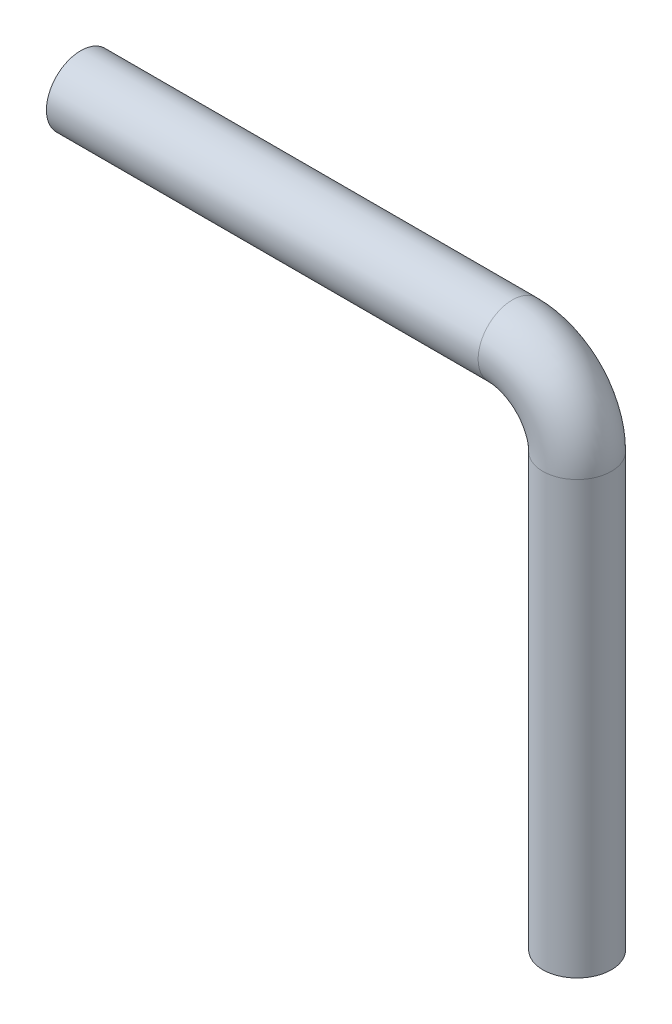
ISO-10303-21;
HEADER;
FILE_DESCRIPTION(('STEP AP214'),'2;1');
FILE_NAME('part.step','',(''),(''),'','','');
FILE_SCHEMA(('AUTOMOTIVE_DESIGN { 1 0 10303 214 1 1 1 1 }'));
ENDSEC;
DATA;
#1=APPLICATION_CONTEXT('core data for automotive mechanical design processes');
#2=APPLICATION_PROTOCOL_DEFINITION('international standard','automotive_design',2000,#1);
#3=PRODUCT_CONTEXT('',#1,'mechanical');
#4=PRODUCT('Part','Part','',(#3));
#5=PRODUCT_RELATED_PRODUCT_CATEGORY('part','',(#4));
#6=PRODUCT_DEFINITION_FORMATION('','',#4);
#7=PRODUCT_DEFINITION_CONTEXT('part definition',#1,'design');
#8=PRODUCT_DEFINITION('design','',#6,#7);
#9=PRODUCT_DEFINITION_SHAPE('','',#8);
#10=(LENGTH_UNIT() NAMED_UNIT(*) SI_UNIT(.MILLI.,.METRE.));
#11=(NAMED_UNIT(*) PLANE_ANGLE_UNIT() SI_UNIT($,.RADIAN.));
#12=(NAMED_UNIT(*) SI_UNIT($,.STERADIAN.) SOLID_ANGLE_UNIT());
#13=UNCERTAINTY_MEASURE_WITH_UNIT(LENGTH_MEASURE(1.E-05),#10,'distance_accuracy_value','');
#14=(GEOMETRIC_REPRESENTATION_CONTEXT(3) GLOBAL_UNCERTAINTY_ASSIGNED_CONTEXT((#13)) GLOBAL_UNIT_ASSIGNED_CONTEXT((#10,
#11,#12)) REPRESENTATION_CONTEXT('',''));
#15=CARTESIAN_POINT('',(0.,0.,0.));
#16=DIRECTION('',(0.,0.,1.));
#17=DIRECTION('',(1.,0.,0.));
#18=AXIS2_PLACEMENT_3D('',#15,#16,#17);
#19=CARTESIAN_POINT('',(134.,234.,50.));
#20=DIRECTION('',(-1.,0.,0.));
#21=DIRECTION('',(0.,0.,1.));
#22=AXIS2_PLACEMENT_3D('',#19,#20,#21);
#23=PLANE('',#22);
#24=CARTESIAN_POINT('',(134.,234.,50.));
#25=DIRECTION('',(-1.,0.,0.));
#26=DIRECTION('',(0.,0.,1.));
#27=AXIS2_PLACEMENT_3D('',#24,#25,#26);
#28=CIRCLE('',#27,2.17500000000001);
#29=CARTESIAN_POINT('',(134.,234.,52.175));
#30=VERTEX_POINT('',#29);
#31=EDGE_CURVE('E88',#30,#30,#28,.T.);
#32=ORIENTED_EDGE('',*,*,#31,.F.);
#33=EDGE_LOOP('',(#32));
#34=FACE_BOUND('',#33,.T.);
#35=CARTESIAN_POINT('',(134.,234.,50.));
#36=DIRECTION('',(-1.,0.,0.));
#37=DIRECTION('',(0.,0.,1.));
#38=AXIS2_PLACEMENT_3D('',#35,#36,#37);
#39=CIRCLE('',#38,3.17500000000001);
#40=CARTESIAN_POINT('',(134.,234.,53.175));
#41=VERTEX_POINT('',#40);
#42=EDGE_CURVE('E68',#41,#41,#39,.T.);
#43=ORIENTED_EDGE('',*,*,#42,.T.);
#44=EDGE_LOOP('',(#43));
#45=FACE_BOUND('',#44,.T.);
#46=ADVANCED_FACE('F52',(#34,#45),#23,.T.);
#47=CARTESIAN_POINT('',(180.,188.,50.));
#48=DIRECTION('',(0.,1.,0.));
#49=DIRECTION('',(0.,0.,1.));
#50=AXIS2_PLACEMENT_3D('',#47,#48,#49);
#51=PLANE('',#50);
#52=CARTESIAN_POINT('',(180.,188.,50.));
#53=DIRECTION('',(0.,1.,0.));
#54=DIRECTION('',(0.,0.,1.));
#55=AXIS2_PLACEMENT_3D('',#52,#53,#54);
#56=CIRCLE('',#55,2.17500000000001);
#57=CARTESIAN_POINT('',(180.,188.,52.175));
#58=VERTEX_POINT('',#57);
#59=EDGE_CURVE('E71',#58,#58,#56,.T.);
#60=ORIENTED_EDGE('',*,*,#59,.T.);
#61=EDGE_LOOP('',(#60));
#62=FACE_BOUND('',#61,.T.);
#63=CARTESIAN_POINT('',(180.,188.,50.));
#64=DIRECTION('',(0.,1.,0.));
#65=DIRECTION('',(0.,0.,1.));
#66=AXIS2_PLACEMENT_3D('',#63,#64,#65);
#67=CIRCLE('',#66,3.17500000000001);
#68=CARTESIAN_POINT('',(180.,188.,53.175));
#69=VERTEX_POINT('',#68);
#70=EDGE_CURVE('E11',#69,#69,#67,.T.);
#71=ORIENTED_EDGE('',*,*,#70,.F.);
#72=EDGE_LOOP('',(#71));
#73=FACE_BOUND('',#72,.T.);
#74=ADVANCED_FACE('F91',(#62,#73),#51,.F.);
#75=CARTESIAN_POINT('',(134.,234.,50.));
#76=DIRECTION('',(1.,0.,0.));
#77=DIRECTION('',(0.,0.,-1.));
#78=AXIS2_PLACEMENT_3D('',#75,#76,#77);
#79=CYLINDRICAL_SURFACE('',#78,3.17500000000001);
#80=CARTESIAN_POINT('',(174.,234.,50.));
#81=DIRECTION('',(1.,0.,0.));
#82=DIRECTION('',(0.,0.,-1.));
#83=AXIS2_PLACEMENT_3D('',#80,#81,#82);
#84=CIRCLE('',#83,3.17500000000001);
#85=CARTESIAN_POINT('',(174.,237.175,50.));
#86=VERTEX_POINT('',#85);
#87=EDGE_CURVE('E63',#86,#86,#84,.F.);
#88=ORIENTED_EDGE('',*,*,#87,.T.);
#89=EDGE_LOOP('',(#88));
#90=FACE_BOUND('',#89,.T.);
#91=ORIENTED_EDGE('',*,*,#42,.F.);
#92=EDGE_LOOP('',(#91));
#93=FACE_BOUND('',#92,.T.);
#94=ADVANCED_FACE('F97',(#90,#93),#79,.T.);
#95=CARTESIAN_POINT('',(174.,228.,50.));
#96=DIRECTION('',(0.,0.,-1.));
#97=DIRECTION('',(-1.,0.,0.));
#98=AXIS2_PLACEMENT_3D('',#95,#96,#97);
#99=TOROIDAL_SURFACE('',#98,6.00000000000001,3.17500000000001);
#100=CARTESIAN_POINT('',(180.,228.,50.));
#101=DIRECTION('',(0.,1.,0.));
#102=DIRECTION('',(-1.,0.,0.));
#103=AXIS2_PLACEMENT_3D('',#100,#101,#102);
#104=CIRCLE('',#103,3.17500000000001);
#105=CARTESIAN_POINT('',(183.175,228.,50.));
#106=VERTEX_POINT('',#105);
#107=EDGE_CURVE('E58',#106,#106,#104,.T.);
#108=CARTESIAN_POINT('',(174.,228.,50.));
#109=DIRECTION('',(0.,0.,-1.));
#110=DIRECTION('',(-1.,0.,0.));
#111=AXIS2_PLACEMENT_3D('',#108,#109,#110);
#112=CIRCLE('',#111,9.17500000000002);
#113=EDGE_CURVE('',#86,#106,#112,.T.);
#114=ORIENTED_EDGE('',*,*,#87,.F.);
#115=ORIENTED_EDGE('',*,*,#107,.T.);
#116=ORIENTED_EDGE('',*,*,#113,.T.);
#117=ORIENTED_EDGE('',*,*,#113,.F.);
#118=EDGE_LOOP('',(#114,#116,#115,#117));
#119=FACE_BOUND('',#118,.T.);
#120=ADVANCED_FACE('F110',(#119),#99,.T.);
#121=CARTESIAN_POINT('',(180.,228.,50.));
#122=DIRECTION('',(0.,-1.,0.));
#123=DIRECTION('',(0.,0.,-1.));
#124=AXIS2_PLACEMENT_3D('',#121,#122,#123);
#125=CYLINDRICAL_SURFACE('',#124,3.17500000000001);
#126=ORIENTED_EDGE('',*,*,#70,.T.);
#127=EDGE_LOOP('',(#126));
#128=FACE_BOUND('',#127,.T.);
#129=ORIENTED_EDGE('',*,*,#107,.F.);
#130=EDGE_LOOP('',(#129));
#131=FACE_BOUND('',#130,.T.);
#132=ADVANCED_FACE('F54',(#128,#131),#125,.T.);
#133=CARTESIAN_POINT('',(134.,234.,50.));
#134=DIRECTION('',(1.,0.,0.));
#135=DIRECTION('',(0.,0.,-1.));
#136=AXIS2_PLACEMENT_3D('',#133,#134,#135);
#137=CYLINDRICAL_SURFACE('',#136,2.17500000000001);
#138=CARTESIAN_POINT('',(174.,234.,50.));
#139=DIRECTION('',(-1.,0.,0.));
#140=DIRECTION('',(0.,0.,1.));
#141=AXIS2_PLACEMENT_3D('',#138,#139,#140);
#142=CIRCLE('',#141,2.17500000000001);
#143=CARTESIAN_POINT('',(174.,236.175,50.));
#144=VERTEX_POINT('',#143);
#145=EDGE_CURVE('E81',#144,#144,#142,.T.);
#146=ORIENTED_EDGE('',*,*,#145,.F.);
#147=EDGE_LOOP('',(#146));
#148=FACE_BOUND('',#147,.T.);
#149=ORIENTED_EDGE('',*,*,#31,.T.);
#150=EDGE_LOOP('',(#149));
#151=FACE_BOUND('',#150,.T.);
#152=ADVANCED_FACE('F89',(#148,#151),#137,.F.);
#153=CARTESIAN_POINT('',(174.,228.,50.));
#154=DIRECTION('',(0.,0.,-1.));
#155=DIRECTION('',(-1.,0.,0.));
#156=AXIS2_PLACEMENT_3D('',#153,#154,#155);
#157=TOROIDAL_SURFACE('',#156,6.00000000000001,2.17500000000001);
#158=CARTESIAN_POINT('',(180.,228.,50.));
#159=DIRECTION('',(0.,1.,0.));
#160=DIRECTION('',(0.,0.,1.));
#161=AXIS2_PLACEMENT_3D('',#158,#159,#160);
#162=CIRCLE('',#161,2.17500000000001);
#163=CARTESIAN_POINT('',(182.175,228.,50.));
#164=VERTEX_POINT('',#163);
#165=EDGE_CURVE('E76',#164,#164,#162,.T.);
#166=CARTESIAN_POINT('',(174.,228.,50.));
#167=DIRECTION('',(0.,0.,-1.));
#168=DIRECTION('',(-1.,0.,0.));
#169=AXIS2_PLACEMENT_3D('',#166,#167,#168);
#170=CIRCLE('',#169,8.17500000000001);
#171=EDGE_CURVE('',#144,#164,#170,.T.);
#172=ORIENTED_EDGE('',*,*,#145,.T.);
#173=ORIENTED_EDGE('',*,*,#165,.F.);
#174=ORIENTED_EDGE('',*,*,#171,.T.);
#175=ORIENTED_EDGE('',*,*,#171,.F.);
#176=EDGE_LOOP('',(#172,#174,#173,#175));
#177=FACE_BOUND('',#176,.T.);
#178=ADVANCED_FACE('F103',(#177),#157,.F.);
#179=CARTESIAN_POINT('',(180.,228.,50.));
#180=DIRECTION('',(0.,-1.,0.));
#181=DIRECTION('',(0.,0.,-1.));
#182=AXIS2_PLACEMENT_3D('',#179,#180,#181);
#183=CYLINDRICAL_SURFACE('',#182,2.17500000000001);
#184=ORIENTED_EDGE('',*,*,#59,.F.);
#185=EDGE_LOOP('',(#184));
#186=FACE_BOUND('',#185,.T.);
#187=ORIENTED_EDGE('',*,*,#165,.T.);
#188=EDGE_LOOP('',(#187));
#189=FACE_BOUND('',#188,.T.);
#190=ADVANCED_FACE('F92',(#186,#189),#183,.F.);
#191=CLOSED_SHELL('',(#46,#74,#94,#120,#132,#152,#178,#190));
#192=MANIFOLD_SOLID_BREP('B2',#191);
#193=ADVANCED_BREP_SHAPE_REPRESENTATION('',(#18,#192),#14);
#194=SHAPE_DEFINITION_REPRESENTATION(#9,#193);
ENDSEC;
END-ISO-10303-21;
